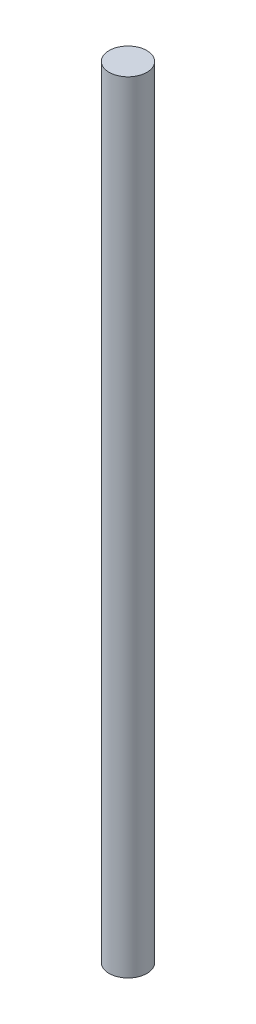
ISO-10303-21;
HEADER;
FILE_DESCRIPTION(('STEP AP214'),'2;1');
FILE_NAME('part.step','',(''),(''),'','','');
FILE_SCHEMA(('AUTOMOTIVE_DESIGN { 1 0 10303 214 1 1 1 1 }'));
ENDSEC;
DATA;
#1=APPLICATION_CONTEXT('core data for automotive mechanical design processes');
#2=APPLICATION_PROTOCOL_DEFINITION('international standard','automotive_design',2000,#1);
#3=PRODUCT_CONTEXT('',#1,'mechanical');
#4=PRODUCT('Part','Part','',(#3));
#5=PRODUCT_RELATED_PRODUCT_CATEGORY('part','',(#4));
#6=PRODUCT_DEFINITION_FORMATION('','',#4);
#7=PRODUCT_DEFINITION_CONTEXT('part definition',#1,'design');
#8=PRODUCT_DEFINITION('design','',#6,#7);
#9=PRODUCT_DEFINITION_SHAPE('','',#8);
#10=(LENGTH_UNIT() NAMED_UNIT(*) SI_UNIT(.MILLI.,.METRE.));
#11=(NAMED_UNIT(*) PLANE_ANGLE_UNIT() SI_UNIT($,.RADIAN.));
#12=(NAMED_UNIT(*) SI_UNIT($,.STERADIAN.) SOLID_ANGLE_UNIT());
#13=UNCERTAINTY_MEASURE_WITH_UNIT(LENGTH_MEASURE(1.E-05),#10,'distance_accuracy_value','');
#14=(GEOMETRIC_REPRESENTATION_CONTEXT(3) GLOBAL_UNCERTAINTY_ASSIGNED_CONTEXT((#13)) GLOBAL_UNIT_ASSIGNED_CONTEXT((#10,
#11,#12)) REPRESENTATION_CONTEXT('',''));
#15=CARTESIAN_POINT('',(0.,0.,0.));
#16=DIRECTION('',(0.,0.,1.));
#17=DIRECTION('',(1.,0.,0.));
#18=AXIS2_PLACEMENT_3D('',#15,#16,#17);
#19=CARTESIAN_POINT('',(0.,310.,0.));
#20=DIRECTION('',(0.,-1.,0.));
#21=DIRECTION('',(0.,0.,-1.));
#22=AXIS2_PLACEMENT_3D('',#19,#20,#21);
#23=CYLINDRICAL_SURFACE('',#22,15.);
#24=CARTESIAN_POINT('',(0.,310.,0.));
#25=DIRECTION('',(0.,1.,0.));
#26=DIRECTION('',(0.,0.,1.));
#27=AXIS2_PLACEMENT_3D('',#24,#25,#26);
#28=CIRCLE('',#27,15.);
#29=CARTESIAN_POINT('',(0.,310.,15.));
#30=VERTEX_POINT('',#29);
#31=EDGE_CURVE('E10',#30,#30,#28,.T.);
#32=ORIENTED_EDGE('',*,*,#31,.F.);
#33=EDGE_LOOP('',(#32));
#34=FACE_BOUND('',#33,.T.);
#35=CARTESIAN_POINT('',(0.,-310.,0.));
#36=DIRECTION('',(0.,1.,0.));
#37=DIRECTION('',(0.,0.,1.));
#38=AXIS2_PLACEMENT_3D('',#35,#36,#37);
#39=CIRCLE('',#38,15.);
#40=CARTESIAN_POINT('',(0.,-310.,15.));
#41=VERTEX_POINT('',#40);
#42=EDGE_CURVE('E36',#41,#41,#39,.T.);
#43=ORIENTED_EDGE('',*,*,#42,.T.);
#44=EDGE_LOOP('',(#43));
#45=FACE_BOUND('',#44,.T.);
#46=ADVANCED_FACE('F33',(#34,#45),#23,.T.);
#47=CARTESIAN_POINT('',(0.,310.,0.));
#48=DIRECTION('',(0.,1.,0.));
#49=DIRECTION('',(0.,0.,1.));
#50=AXIS2_PLACEMENT_3D('',#47,#48,#49);
#51=PLANE('',#50);
#52=ORIENTED_EDGE('',*,*,#31,.T.);
#53=EDGE_LOOP('',(#52));
#54=FACE_BOUND('',#53,.T.);
#55=ADVANCED_FACE('F48',(#54),#51,.T.);
#56=CARTESIAN_POINT('',(0.,-310.,0.));
#57=DIRECTION('',(0.,1.,0.));
#58=DIRECTION('',(0.,0.,1.));
#59=AXIS2_PLACEMENT_3D('',#56,#57,#58);
#60=PLANE('',#59);
#61=ORIENTED_EDGE('',*,*,#42,.F.);
#62=EDGE_LOOP('',(#61));
#63=FACE_BOUND('',#62,.T.);
#64=ADVANCED_FACE('F46',(#63),#60,.F.);
#65=CLOSED_SHELL('',(#46,#55,#64));
#66=MANIFOLD_SOLID_BREP('B2',#65);
#67=ADVANCED_BREP_SHAPE_REPRESENTATION('',(#18,#66),#14);
#68=SHAPE_DEFINITION_REPRESENTATION(#9,#67);
ENDSEC;
END-ISO-10303-21;
